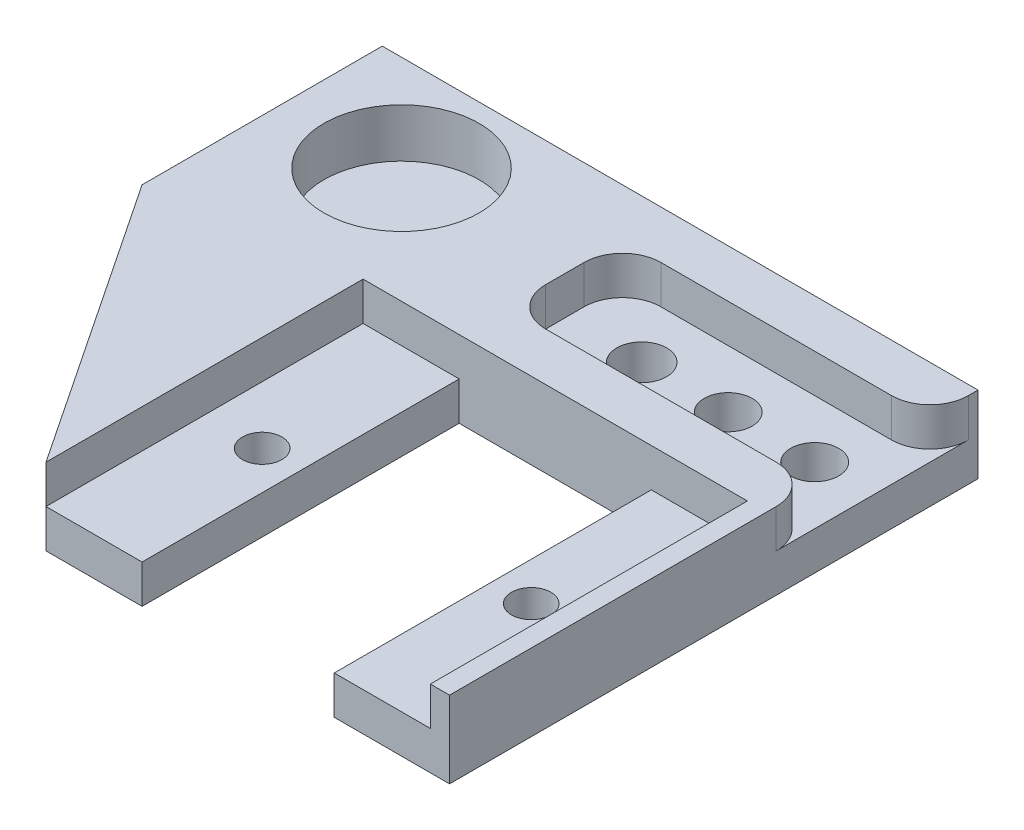
ISO-10303-21;
HEADER;
FILE_DESCRIPTION(('STEP AP214'),'2;1');
FILE_NAME('part.step','',(''),(''),'','','');
FILE_SCHEMA(('AUTOMOTIVE_DESIGN { 1 0 10303 214 1 1 1 1 }'));
ENDSEC;
DATA;
#1=APPLICATION_CONTEXT('core data for automotive mechanical design processes');
#2=APPLICATION_PROTOCOL_DEFINITION('international standard','automotive_design',2000,#1);
#3=PRODUCT_CONTEXT('',#1,'mechanical');
#4=PRODUCT('Part','Part','',(#3));
#5=PRODUCT_RELATED_PRODUCT_CATEGORY('part','',(#4));
#6=PRODUCT_DEFINITION_FORMATION('','',#4);
#7=PRODUCT_DEFINITION_CONTEXT('part definition',#1,'design');
#8=PRODUCT_DEFINITION('design','',#6,#7);
#9=PRODUCT_DEFINITION_SHAPE('','',#8);
#10=(LENGTH_UNIT() NAMED_UNIT(*) SI_UNIT(.MILLI.,.METRE.));
#11=(NAMED_UNIT(*) PLANE_ANGLE_UNIT() SI_UNIT($,.RADIAN.));
#12=(NAMED_UNIT(*) SI_UNIT($,.STERADIAN.) SOLID_ANGLE_UNIT());
#13=UNCERTAINTY_MEASURE_WITH_UNIT(LENGTH_MEASURE(1.E-05),#10,'distance_accuracy_value','');
#14=(GEOMETRIC_REPRESENTATION_CONTEXT(3) GLOBAL_UNCERTAINTY_ASSIGNED_CONTEXT((#13)) GLOBAL_UNIT_ASSIGNED_CONTEXT((#10,
#11,#12)) REPRESENTATION_CONTEXT('',''));
#15=CARTESIAN_POINT('',(0.,0.,0.));
#16=DIRECTION('',(0.,0.,1.));
#17=DIRECTION('',(1.,0.,0.));
#18=AXIS2_PLACEMENT_3D('',#15,#16,#17);
#19=CARTESIAN_POINT('',(10.,2.,30.));
#20=DIRECTION('',(0.,0.,-1.));
#21=DIRECTION('',(-1.,0.,0.));
#22=AXIS2_PLACEMENT_3D('',#19,#20,#21);
#23=PLANE('',#22);
#24=DIRECTION('',(1.,0.,0.));
#25=VECTOR('',#24,1.);
#26=CARTESIAN_POINT('',(10.,2.,30.));
#27=LINE('',#26,#25);
#28=CARTESIAN_POINT('',(30.,2.,30.));
#29=VERTEX_POINT('',#28);
#30=CARTESIAN_POINT('',(31.,2.,30.));
#31=VERTEX_POINT('',#30);
#32=EDGE_CURVE('E225',#29,#31,#27,.T.);
#33=ORIENTED_EDGE('',*,*,#32,.F.);
#34=DIRECTION('',(0.,1.,0.));
#35=VECTOR('',#34,1.);
#36=CARTESIAN_POINT('',(30.,0.,30.));
#37=LINE('',#36,#35);
#38=CARTESIAN_POINT('',(30.,0.,30.));
#39=VERTEX_POINT('',#38);
#40=EDGE_CURVE('E347',#39,#29,#37,.T.);
#41=ORIENTED_EDGE('',*,*,#40,.F.);
#42=DIRECTION('',(1.,0.,0.));
#43=VECTOR('',#42,1.);
#44=CARTESIAN_POINT('',(10.,0.,30.));
#45=LINE('',#44,#43);
#46=CARTESIAN_POINT('',(25.,0.,30.));
#47=VERTEX_POINT('',#46);
#48=EDGE_CURVE('E374',#47,#39,#45,.T.);
#49=ORIENTED_EDGE('',*,*,#48,.F.);
#50=DIRECTION('',(0.,1.,0.));
#51=VECTOR('',#50,1.);
#52=CARTESIAN_POINT('',(25.,-2.,30.));
#53=LINE('',#52,#51);
#54=CARTESIAN_POINT('',(25.,-2.,30.));
#55=VERTEX_POINT('',#54);
#56=EDGE_CURVE('E404',#55,#47,#53,.T.);
#57=ORIENTED_EDGE('',*,*,#56,.F.);
#58=DIRECTION('',(-1.,0.,0.));
#59=VECTOR('',#58,1.);
#60=CARTESIAN_POINT('',(31.,-2.,30.));
#61=LINE('',#60,#59);
#62=CARTESIAN_POINT('',(31.,-2.,30.));
#63=VERTEX_POINT('',#62);
#64=EDGE_CURVE('E423',#63,#55,#61,.T.);
#65=ORIENTED_EDGE('',*,*,#64,.F.);
#66=DIRECTION('',(0.,-1.,0.));
#67=VECTOR('',#66,1.);
#68=CARTESIAN_POINT('',(31.,2.,30.));
#69=LINE('',#68,#67);
#70=EDGE_CURVE('E234',#31,#63,#69,.T.);
#71=ORIENTED_EDGE('',*,*,#70,.F.);
#72=EDGE_LOOP('',(#33,#41,#49,#57,#65,#71));
#73=FACE_BOUND('',#72,.T.);
#74=ADVANCED_FACE('F53',(#73),#23,.F.);
#75=CARTESIAN_POINT('',(0.,2.,-15.));
#76=DIRECTION('',(1.,0.,0.));
#77=DIRECTION('',(0.,0.,-1.));
#78=AXIS2_PLACEMENT_3D('',#75,#76,#77);
#79=PLANE('',#78);
#80=DIRECTION('',(0.,0.,1.));
#81=VECTOR('',#80,1.);
#82=CARTESIAN_POINT('',(0.,2.,-15.));
#83=LINE('',#82,#81);
#84=CARTESIAN_POINT('',(0.,2.,2.5));
#85=VERTEX_POINT('',#84);
#86=CARTESIAN_POINT('',(0.,2.,15.));
#87=VERTEX_POINT('',#86);
#88=EDGE_CURVE('E207',#85,#87,#83,.T.);
#89=ORIENTED_EDGE('',*,*,#88,.F.);
#90=DIRECTION('',(0.,1.,0.));
#91=VECTOR('',#90,1.);
#92=CARTESIAN_POINT('',(0.,-8.,2.5));
#93=LINE('',#92,#91);
#94=CARTESIAN_POINT('',(0.,-2.,2.5));
#95=VERTEX_POINT('',#94);
#96=EDGE_CURVE('E193',#95,#85,#93,.T.);
#97=ORIENTED_EDGE('',*,*,#96,.F.);
#98=DIRECTION('',(0.,0.,-1.));
#99=VECTOR('',#98,1.);
#100=CARTESIAN_POINT('',(0.,-2.,15.));
#101=LINE('',#100,#99);
#102=CARTESIAN_POINT('',(0.,-2.,15.));
#103=VERTEX_POINT('',#102);
#104=EDGE_CURVE('E219',#103,#95,#101,.T.);
#105=ORIENTED_EDGE('',*,*,#104,.F.);
#106=DIRECTION('',(0.,-1.,0.));
#107=VECTOR('',#106,1.);
#108=CARTESIAN_POINT('',(0.,2.,15.));
#109=LINE('',#108,#107);
#110=EDGE_CURVE('E215',#87,#103,#109,.T.);
#111=ORIENTED_EDGE('',*,*,#110,.F.);
#112=EDGE_LOOP('',(#89,#97,#105,#111));
#113=FACE_BOUND('',#112,.T.);
#114=ADVANCED_FACE('F213',(#113),#79,.F.);
#115=CARTESIAN_POINT('',(0.,2.,15.));
#116=DIRECTION('',(0.832050294337844,0.,-0.554700196225229));
#117=DIRECTION('',(-0.554700196225229,0.,-0.832050294337844));
#118=AXIS2_PLACEMENT_3D('',#115,#116,#117);
#119=PLANE('',#118);
#120=ORIENTED_EDGE('',*,*,#110,.T.);
#121=DIRECTION('',(-0.554700196225229,0.,-0.832050294337844));
#122=VECTOR('',#121,1.);
#123=CARTESIAN_POINT('',(10.,-2.,30.));
#124=LINE('',#123,#122);
#125=CARTESIAN_POINT('',(10.,-2.,30.));
#126=VERTEX_POINT('',#125);
#127=EDGE_CURVE('E227',#126,#103,#124,.T.);
#128=ORIENTED_EDGE('',*,*,#127,.F.);
#129=DIRECTION('',(0.,-1.,0.));
#130=VECTOR('',#129,1.);
#131=CARTESIAN_POINT('',(10.,2.,30.));
#132=LINE('',#131,#130);
#133=CARTESIAN_POINT('',(10.,0.,30.));
#134=VERTEX_POINT('',#133);
#135=EDGE_CURVE('E238',#134,#126,#132,.T.);
#136=ORIENTED_EDGE('',*,*,#135,.F.);
#137=CARTESIAN_POINT('',(10.,2.,30.));
#138=VERTEX_POINT('',#137);
#139=EDGE_CURVE('E239',#138,#134,#132,.T.);
#140=ORIENTED_EDGE('',*,*,#139,.F.);
#141=DIRECTION('',(0.554700196225229,0.,0.832050294337844));
#142=VECTOR('',#141,1.);
#143=CARTESIAN_POINT('',(0.,2.,15.));
#144=LINE('',#143,#142);
#145=EDGE_CURVE('E218',#87,#138,#144,.T.);
#146=ORIENTED_EDGE('',*,*,#145,.F.);
#147=EDGE_LOOP('',(#120,#128,#136,#140,#146));
#148=FACE_BOUND('',#147,.T.);
#149=ADVANCED_FACE('F436',(#148),#119,.F.);
#150=DIRECTION('',(0.,1.,0.));
#151=VECTOR('',#150,1.);
#152=CARTESIAN_POINT('',(15.,2.,30.));
#153=LINE('',#152,#151);
#154=CARTESIAN_POINT('',(15.,-2.,30.));
#155=VERTEX_POINT('',#154);
#156=CARTESIAN_POINT('',(15.,0.,30.));
#157=VERTEX_POINT('',#156);
#158=EDGE_CURVE('E408',#155,#157,#153,.T.);
#159=ORIENTED_EDGE('',*,*,#158,.T.);
#160=EDGE_CURVE('E375',#134,#157,#45,.T.);
#161=ORIENTED_EDGE('',*,*,#160,.F.);
#162=ORIENTED_EDGE('',*,*,#135,.T.);
#163=EDGE_CURVE('E422',#155,#126,#61,.T.);
#164=ORIENTED_EDGE('',*,*,#163,.F.);
#165=EDGE_LOOP('',(#159,#161,#162,#164));
#166=FACE_BOUND('',#165,.T.);
#167=ADVANCED_FACE('F552',(#166),#23,.F.);
#168=CARTESIAN_POINT('',(58.,2.,7.00498882584149));
#169=DIRECTION('',(0.,-1.,0.));
#170=DIRECTION('',(0.,0.,-1.));
#171=AXIS2_PLACEMENT_3D('',#168,#169,#170);
#172=PLANE('',#171);
#173=CARTESIAN_POINT('',(6.,2.,7.5));
#174=DIRECTION('',(0.,1.,0.));
#175=DIRECTION('',(0.,0.,1.));
#176=AXIS2_PLACEMENT_3D('',#173,#174,#175);
#177=CIRCLE('',#176,4.04);
#178=CARTESIAN_POINT('',(6.,2.,11.54));
#179=VERTEX_POINT('',#178);
#180=EDGE_CURVE('E508',#179,#179,#177,.T.);
#181=ORIENTED_EDGE('',*,*,#180,.F.);
#182=EDGE_LOOP('',(#181));
#183=FACE_BOUND('',#182,.T.);
#184=DIRECTION('',(0.,0.,-1.));
#185=VECTOR('',#184,1.);
#186=CARTESIAN_POINT('',(31.,2.,2.));
#187=LINE('',#186,#185);
#188=CARTESIAN_POINT('',(31.,2.,3.));
#189=VERTEX_POINT('',#188);
#190=CARTESIAN_POINT('',(31.,2.,2.5));
#191=VERTEX_POINT('',#190);
#192=EDGE_CURVE('E210',#189,#191,#187,.T.);
#193=ORIENTED_EDGE('',*,*,#192,.T.);
#194=DIRECTION('',(1.,0.,0.));
#195=VECTOR('',#194,1.);
#196=CARTESIAN_POINT('',(0.,2.,2.5));
#197=LINE('',#196,#195);
#198=EDGE_CURVE('E196',#85,#191,#197,.T.);
#199=ORIENTED_EDGE('',*,*,#198,.F.);
#200=ORIENTED_EDGE('',*,*,#88,.T.);
#201=ORIENTED_EDGE('',*,*,#145,.T.);
#202=DIRECTION('',(0.,0.,1.));
#203=VECTOR('',#202,1.);
#204=CARTESIAN_POINT('',(10.,2.,30.));
#205=LINE('',#204,#203);
#206=CARTESIAN_POINT('',(10.,2.,13.5));
#207=VERTEX_POINT('',#206);
#208=EDGE_CURVE('E362',#207,#138,#205,.T.);
#209=ORIENTED_EDGE('',*,*,#208,.F.);
#210=DIRECTION('',(-1.,0.,0.));
#211=VECTOR('',#210,1.);
#212=CARTESIAN_POINT('',(25.,2.,13.5));
#213=LINE('',#212,#211);
#214=CARTESIAN_POINT('',(30.,2.,13.5));
#215=VERTEX_POINT('',#214);
#216=EDGE_CURVE('E388',#215,#207,#213,.T.);
#217=ORIENTED_EDGE('',*,*,#216,.F.);
#218=DIRECTION('',(0.,0.,-1.));
#219=VECTOR('',#218,1.);
#220=CARTESIAN_POINT('',(30.,2.,30.));
#221=LINE('',#220,#219);
#222=EDGE_CURVE('E358',#29,#215,#221,.T.);
#223=ORIENTED_EDGE('',*,*,#222,.F.);
#224=ORIENTED_EDGE('',*,*,#32,.T.);
#225=CARTESIAN_POINT('',(31.,2.,13.));
#226=VERTEX_POINT('',#225);
#227=EDGE_CURVE('E317',#31,#226,#187,.T.);
#228=ORIENTED_EDGE('',*,*,#227,.T.);
#229=CARTESIAN_POINT('',(29.,2.,13.));
#230=DIRECTION('',(0.,-1.,0.));
#231=DIRECTION('',(0.,0.,-1.));
#232=AXIS2_PLACEMENT_3D('',#229,#230,#231);
#233=CIRCLE('',#232,2.);
#234=CARTESIAN_POINT('',(29.,2.,11.));
#235=VERTEX_POINT('',#234);
#236=EDGE_CURVE('E280',#226,#235,#233,.F.);
#237=ORIENTED_EDGE('',*,*,#236,.T.);
#238=DIRECTION('',(1.,0.,0.));
#239=VECTOR('',#238,1.);
#240=CARTESIAN_POINT('',(31.,2.,11.));
#241=LINE('',#240,#239);
#242=CARTESIAN_POINT('',(17.,2.,11.));
#243=VERTEX_POINT('',#242);
#244=EDGE_CURVE('E329',#243,#235,#241,.T.);
#245=ORIENTED_EDGE('',*,*,#244,.F.);
#246=CARTESIAN_POINT('',(17.,2.,9.));
#247=DIRECTION('',(0.,-1.,0.));
#248=DIRECTION('',(0.,0.,-1.));
#249=AXIS2_PLACEMENT_3D('',#246,#247,#248);
#250=CIRCLE('',#249,2.);
#251=CARTESIAN_POINT('',(15.,2.,9.));
#252=VERTEX_POINT('',#251);
#253=EDGE_CURVE('E283',#243,#252,#250,.T.);
#254=ORIENTED_EDGE('',*,*,#253,.T.);
#255=DIRECTION('',(0.,0.,1.));
#256=VECTOR('',#255,1.);
#257=CARTESIAN_POINT('',(15.,2.,11.));
#258=LINE('',#257,#256);
#259=CARTESIAN_POINT('',(15.,2.,7.));
#260=VERTEX_POINT('',#259);
#261=EDGE_CURVE('E469',#260,#252,#258,.T.);
#262=ORIENTED_EDGE('',*,*,#261,.F.);
#263=CARTESIAN_POINT('',(17.,2.,7.));
#264=DIRECTION('',(0.,-1.,0.));
#265=DIRECTION('',(0.,0.,-1.));
#266=AXIS2_PLACEMENT_3D('',#263,#264,#265);
#267=CIRCLE('',#266,2.);
#268=CARTESIAN_POINT('',(17.,2.,5.));
#269=VERTEX_POINT('',#268);
#270=EDGE_CURVE('E286',#260,#269,#267,.T.);
#271=ORIENTED_EDGE('',*,*,#270,.T.);
#272=DIRECTION('',(-1.,0.,0.));
#273=VECTOR('',#272,1.);
#274=CARTESIAN_POINT('',(31.,2.,5.));
#275=LINE('',#274,#273);
#276=CARTESIAN_POINT('',(29.,2.,5.));
#277=VERTEX_POINT('',#276);
#278=EDGE_CURVE('E313',#277,#269,#275,.T.);
#279=ORIENTED_EDGE('',*,*,#278,.F.);
#280=CARTESIAN_POINT('',(29.,2.,3.));
#281=DIRECTION('',(0.,-1.,0.));
#282=DIRECTION('',(0.,0.,-1.));
#283=AXIS2_PLACEMENT_3D('',#280,#281,#282);
#284=CIRCLE('',#283,2.);
#285=EDGE_CURVE('E277',#277,#189,#284,.F.);
#286=ORIENTED_EDGE('',*,*,#285,.T.);
#287=EDGE_LOOP('',(#193,#199,#200,#201,#209,#217,#223,#224,#228,#237,#245,#254,#262,#271,#279,#286));
#288=FACE_BOUND('',#287,.T.);
#289=ADVANCED_FACE('F205',(#183,#288),#172,.F.);
#290=CARTESIAN_POINT('',(31.,-3.,-30.));
#291=DIRECTION('',(-1.,0.,0.));
#292=DIRECTION('',(0.,0.,1.));
#293=AXIS2_PLACEMENT_3D('',#290,#291,#292);
#294=PLANE('',#293);
#295=DIRECTION('',(0.,0.,1.));
#296=VECTOR('',#295,1.);
#297=CARTESIAN_POINT('',(31.,-2.,-30.));
#298=LINE('',#297,#296);
#299=CARTESIAN_POINT('',(31.,-2.,2.5));
#300=VERTEX_POINT('',#299);
#301=EDGE_CURVE('E419',#300,#63,#298,.T.);
#302=ORIENTED_EDGE('',*,*,#301,.F.);
#303=DIRECTION('',(0.,1.,0.));
#304=VECTOR('',#303,1.);
#305=CARTESIAN_POINT('',(31.,-8.,2.5));
#306=LINE('',#305,#304);
#307=EDGE_CURVE('E70',#300,#191,#306,.T.);
#308=ORIENTED_EDGE('',*,*,#307,.T.);
#309=ORIENTED_EDGE('',*,*,#192,.F.);
#310=DIRECTION('',(0.,1.,0.));
#311=VECTOR('',#310,1.);
#312=CARTESIAN_POINT('',(31.,-3.,3.));
#313=LINE('',#312,#311);
#314=CARTESIAN_POINT('',(31.,0.,3.));
#315=VERTEX_POINT('',#314);
#316=EDGE_CURVE('E271',#189,#315,#313,.F.);
#317=ORIENTED_EDGE('',*,*,#316,.T.);
#318=DIRECTION('',(0.,0.,-1.));
#319=VECTOR('',#318,1.);
#320=CARTESIAN_POINT('',(31.,0.,11.));
#321=LINE('',#320,#319);
#322=CARTESIAN_POINT('',(31.,0.,13.));
#323=VERTEX_POINT('',#322);
#324=EDGE_CURVE('E77',#323,#315,#321,.T.);
#325=ORIENTED_EDGE('',*,*,#324,.F.);
#326=DIRECTION('',(0.,1.,0.));
#327=VECTOR('',#326,1.);
#328=CARTESIAN_POINT('',(31.,-3.,13.));
#329=LINE('',#328,#327);
#330=EDGE_CURVE('E274',#323,#226,#329,.T.);
#331=ORIENTED_EDGE('',*,*,#330,.T.);
#332=ORIENTED_EDGE('',*,*,#227,.F.);
#333=ORIENTED_EDGE('',*,*,#70,.T.);
#334=EDGE_LOOP('',(#302,#308,#309,#317,#325,#331,#332,#333));
#335=FACE_BOUND('',#334,.T.);
#336=ADVANCED_FACE('F315',(#335),#294,.F.);
#337=CARTESIAN_POINT('',(0.,-2.,0.));
#338=DIRECTION('',(0.,1.,0.));
#339=DIRECTION('',(0.,0.,1.));
#340=AXIS2_PLACEMENT_3D('',#337,#338,#339);
#341=PLANE('',#340);
#342=CARTESIAN_POINT('',(19.,-2.,8.));
#343=DIRECTION('',(0.,-1.,0.));
#344=DIRECTION('',(0.,0.,-1.));
#345=AXIS2_PLACEMENT_3D('',#342,#343,#344);
#346=CIRCLE('',#345,1.3);
#347=CARTESIAN_POINT('',(19.,-2.,6.7));
#348=VERTEX_POINT('',#347);
#349=EDGE_CURVE('E517',#348,#348,#346,.T.);
#350=ORIENTED_EDGE('',*,*,#349,.F.);
#351=EDGE_LOOP('',(#350));
#352=FACE_BOUND('',#351,.T.);
#353=CARTESIAN_POINT('',(23.5,-2.,8.));
#354=DIRECTION('',(0.,1.,0.));
#355=DIRECTION('',(0.,0.,1.));
#356=AXIS2_PLACEMENT_3D('',#353,#354,#355);
#357=CIRCLE('',#356,1.25);
#358=CARTESIAN_POINT('',(23.5,-2.,9.25));
#359=VERTEX_POINT('',#358);
#360=EDGE_CURVE('E501',#359,#359,#357,.T.);
#361=ORIENTED_EDGE('',*,*,#360,.T.);
#362=EDGE_LOOP('',(#361));
#363=FACE_BOUND('',#362,.T.);
#364=CARTESIAN_POINT('',(28.,-2.,8.));
#365=DIRECTION('',(0.,1.,0.));
#366=DIRECTION('',(0.,0.,1.));
#367=AXIS2_PLACEMENT_3D('',#364,#365,#366);
#368=CIRCLE('',#367,1.25);
#369=CARTESIAN_POINT('',(28.,-2.,9.25));
#370=VERTEX_POINT('',#369);
#371=EDGE_CURVE('E492',#370,#370,#368,.T.);
#372=ORIENTED_EDGE('',*,*,#371,.T.);
#373=EDGE_LOOP('',(#372));
#374=FACE_BOUND('',#373,.T.);
#375=CARTESIAN_POINT('',(27.,-2.,21.75));
#376=DIRECTION('',(0.,-1.,0.));
#377=DIRECTION('',(0.,0.,-1.));
#378=AXIS2_PLACEMENT_3D('',#375,#376,#377);
#379=CIRCLE('',#378,1.02499999999999);
#380=CARTESIAN_POINT('',(27.,-2.,20.725));
#381=VERTEX_POINT('',#380);
#382=EDGE_CURVE('E324',#381,#381,#379,.T.);
#383=ORIENTED_EDGE('',*,*,#382,.F.);
#384=EDGE_LOOP('',(#383));
#385=FACE_BOUND('',#384,.T.);
#386=CARTESIAN_POINT('',(13.,-2.,21.75));
#387=DIRECTION('',(0.,-1.,0.));
#388=DIRECTION('',(0.,0.,-1.));
#389=AXIS2_PLACEMENT_3D('',#386,#387,#388);
#390=CIRCLE('',#389,1.02499999999999);
#391=CARTESIAN_POINT('',(13.,-2.,20.725));
#392=VERTEX_POINT('',#391);
#393=EDGE_CURVE('E338',#392,#392,#390,.T.);
#394=ORIENTED_EDGE('',*,*,#393,.F.);
#395=EDGE_LOOP('',(#394));
#396=FACE_BOUND('',#395,.T.);
#397=ORIENTED_EDGE('',*,*,#104,.T.);
#398=DIRECTION('',(1.,0.,0.));
#399=VECTOR('',#398,1.);
#400=CARTESIAN_POINT('',(0.,-2.,2.5));
#401=LINE('',#400,#399);
#402=EDGE_CURVE('E12',#95,#300,#401,.T.);
#403=ORIENTED_EDGE('',*,*,#402,.T.);
#404=ORIENTED_EDGE('',*,*,#301,.T.);
#405=ORIENTED_EDGE('',*,*,#64,.T.);
#406=DIRECTION('',(0.,0.,-1.));
#407=VECTOR('',#406,1.);
#408=CARTESIAN_POINT('',(25.,-2.,30.));
#409=LINE('',#408,#407);
#410=CARTESIAN_POINT('',(25.,-2.,13.5));
#411=VERTEX_POINT('',#410);
#412=EDGE_CURVE('E389',#55,#411,#409,.T.);
#413=ORIENTED_EDGE('',*,*,#412,.T.);
#414=DIRECTION('',(-1.,0.,0.));
#415=VECTOR('',#414,1.);
#416=CARTESIAN_POINT('',(25.,-2.,13.5));
#417=LINE('',#416,#415);
#418=CARTESIAN_POINT('',(15.,-2.,13.5));
#419=VERTEX_POINT('',#418);
#420=EDGE_CURVE('E393',#411,#419,#417,.T.);
#421=ORIENTED_EDGE('',*,*,#420,.T.);
#422=DIRECTION('',(0.,0.,1.));
#423=VECTOR('',#422,1.);
#424=CARTESIAN_POINT('',(15.,-2.,13.5));
#425=LINE('',#424,#423);
#426=EDGE_CURVE('E397',#419,#155,#425,.T.);
#427=ORIENTED_EDGE('',*,*,#426,.T.);
#428=ORIENTED_EDGE('',*,*,#163,.T.);
#429=ORIENTED_EDGE('',*,*,#127,.T.);
#430=EDGE_LOOP('',(#397,#403,#404,#405,#413,#421,#427,#428,#429));
#431=FACE_BOUND('',#430,.T.);
#432=ADVANCED_FACE('F432',(#352,#363,#374,#385,#396,#431),#341,.F.);
#433=CARTESIAN_POINT('',(15.,-2.,13.5));
#434=DIRECTION('',(-1.,0.,0.));
#435=DIRECTION('',(0.,0.,1.));
#436=AXIS2_PLACEMENT_3D('',#433,#434,#435);
#437=PLANE('',#436);
#438=DIRECTION('',(0.,1.,0.));
#439=VECTOR('',#438,1.);
#440=CARTESIAN_POINT('',(15.,-2.,13.5));
#441=LINE('',#440,#439);
#442=CARTESIAN_POINT('',(15.,0.,13.5));
#443=VERTEX_POINT('',#442);
#444=EDGE_CURVE('E409',#419,#443,#441,.T.);
#445=ORIENTED_EDGE('',*,*,#444,.T.);
#446=DIRECTION('',(0.,0.,1.));
#447=VECTOR('',#446,1.);
#448=CARTESIAN_POINT('',(15.,0.,13.5));
#449=LINE('',#448,#447);
#450=EDGE_CURVE('E384',#443,#157,#449,.T.);
#451=ORIENTED_EDGE('',*,*,#450,.T.);
#452=ORIENTED_EDGE('',*,*,#158,.F.);
#453=ORIENTED_EDGE('',*,*,#426,.F.);
#454=EDGE_LOOP('',(#445,#451,#452,#453));
#455=FACE_BOUND('',#454,.T.);
#456=ADVANCED_FACE('F570',(#455),#437,.F.);
#457=CARTESIAN_POINT('',(25.,-2.,30.));
#458=DIRECTION('',(1.,0.,0.));
#459=DIRECTION('',(0.,0.,-1.));
#460=AXIS2_PLACEMENT_3D('',#457,#458,#459);
#461=PLANE('',#460);
#462=ORIENTED_EDGE('',*,*,#56,.T.);
#463=DIRECTION('',(0.,0.,-1.));
#464=VECTOR('',#463,1.);
#465=CARTESIAN_POINT('',(25.,0.,30.));
#466=LINE('',#465,#464);
#467=CARTESIAN_POINT('',(25.,0.,13.5));
#468=VERTEX_POINT('',#467);
#469=EDGE_CURVE('E366',#47,#468,#466,.T.);
#470=ORIENTED_EDGE('',*,*,#469,.T.);
#471=DIRECTION('',(0.,1.,0.));
#472=VECTOR('',#471,1.);
#473=CARTESIAN_POINT('',(25.,-2.,13.5));
#474=LINE('',#473,#472);
#475=EDGE_CURVE('E401',#411,#468,#474,.T.);
#476=ORIENTED_EDGE('',*,*,#475,.F.);
#477=ORIENTED_EDGE('',*,*,#412,.F.);
#478=EDGE_LOOP('',(#462,#470,#476,#477));
#479=FACE_BOUND('',#478,.T.);
#480=ADVANCED_FACE('F573',(#479),#461,.F.);
#481=CARTESIAN_POINT('',(25.,-2.,13.5));
#482=DIRECTION('',(0.,0.,-1.));
#483=DIRECTION('',(-1.,0.,0.));
#484=AXIS2_PLACEMENT_3D('',#481,#482,#483);
#485=PLANE('',#484);
#486=ORIENTED_EDGE('',*,*,#475,.T.);
#487=DIRECTION('',(-1.,0.,0.));
#488=VECTOR('',#487,1.);
#489=CARTESIAN_POINT('',(10.,0.,13.5));
#490=LINE('',#489,#488);
#491=CARTESIAN_POINT('',(30.,0.,13.5));
#492=VERTEX_POINT('',#491);
#493=EDGE_CURVE('E367',#492,#468,#490,.T.);
#494=ORIENTED_EDGE('',*,*,#493,.F.);
#495=DIRECTION('',(0.,1.,0.));
#496=VECTOR('',#495,1.);
#497=CARTESIAN_POINT('',(30.,0.,13.5));
#498=LINE('',#497,#496);
#499=EDGE_CURVE('E351',#492,#215,#498,.T.);
#500=ORIENTED_EDGE('',*,*,#499,.T.);
#501=ORIENTED_EDGE('',*,*,#216,.T.);
#502=DIRECTION('',(0.,1.,0.));
#503=VECTOR('',#502,1.);
#504=CARTESIAN_POINT('',(10.,0.,13.5));
#505=LINE('',#504,#503);
#506=CARTESIAN_POINT('',(10.,0.,13.5));
#507=VERTEX_POINT('',#506);
#508=EDGE_CURVE('E346',#507,#207,#505,.T.);
#509=ORIENTED_EDGE('',*,*,#508,.F.);
#510=EDGE_CURVE('E350',#443,#507,#490,.T.);
#511=ORIENTED_EDGE('',*,*,#510,.F.);
#512=ORIENTED_EDGE('',*,*,#444,.F.);
#513=ORIENTED_EDGE('',*,*,#420,.F.);
#514=EDGE_LOOP('',(#486,#494,#500,#501,#509,#511,#512,#513));
#515=FACE_BOUND('',#514,.T.);
#516=ADVANCED_FACE('F446',(#515),#485,.F.);
#517=CARTESIAN_POINT('',(0.,0.,0.));
#518=DIRECTION('',(0.,-1.,0.));
#519=DIRECTION('',(0.,0.,-1.));
#520=AXIS2_PLACEMENT_3D('',#517,#518,#519);
#521=PLANE('',#520);
#522=CARTESIAN_POINT('',(27.,0.,21.75));
#523=DIRECTION('',(0.,-1.,0.));
#524=DIRECTION('',(0.,0.,-1.));
#525=AXIS2_PLACEMENT_3D('',#522,#523,#524);
#526=CIRCLE('',#525,1.02499999999999);
#527=CARTESIAN_POINT('',(27.,0.,20.725));
#528=VERTEX_POINT('',#527);
#529=EDGE_CURVE('E334',#528,#528,#526,.T.);
#530=ORIENTED_EDGE('',*,*,#529,.T.);
#531=EDGE_LOOP('',(#530));
#532=FACE_BOUND('',#531,.T.);
#533=ORIENTED_EDGE('',*,*,#48,.T.);
#534=DIRECTION('',(0.,0.,-1.));
#535=VECTOR('',#534,1.);
#536=CARTESIAN_POINT('',(30.,0.,30.));
#537=LINE('',#536,#535);
#538=EDGE_CURVE('E370',#39,#492,#537,.T.);
#539=ORIENTED_EDGE('',*,*,#538,.T.);
#540=ORIENTED_EDGE('',*,*,#493,.T.);
#541=ORIENTED_EDGE('',*,*,#469,.F.);
#542=EDGE_LOOP('',(#533,#539,#540,#541));
#543=FACE_BOUND('',#542,.T.);
#544=ADVANCED_FACE('F575',(#532,#543),#521,.F.);
#545=CARTESIAN_POINT('',(30.,0.,30.));
#546=DIRECTION('',(1.,0.,0.));
#547=DIRECTION('',(0.,0.,-1.));
#548=AXIS2_PLACEMENT_3D('',#545,#546,#547);
#549=PLANE('',#548);
#550=ORIENTED_EDGE('',*,*,#222,.T.);
#551=ORIENTED_EDGE('',*,*,#499,.F.);
#552=ORIENTED_EDGE('',*,*,#538,.F.);
#553=ORIENTED_EDGE('',*,*,#40,.T.);
#554=EDGE_LOOP('',(#550,#551,#552,#553));
#555=FACE_BOUND('',#554,.T.);
#556=ADVANCED_FACE('F451',(#555),#549,.F.);
#557=CARTESIAN_POINT('',(13.,0.,21.75));
#558=DIRECTION('',(0.,-1.,0.));
#559=DIRECTION('',(0.,0.,-1.));
#560=AXIS2_PLACEMENT_3D('',#557,#558,#559);
#561=CIRCLE('',#560,1.02499999999999);
#562=CARTESIAN_POINT('',(13.,0.,20.725));
#563=VERTEX_POINT('',#562);
#564=EDGE_CURVE('E342',#563,#563,#561,.T.);
#565=ORIENTED_EDGE('',*,*,#564,.T.);
#566=EDGE_LOOP('',(#565));
#567=FACE_BOUND('',#566,.T.);
#568=ORIENTED_EDGE('',*,*,#510,.T.);
#569=DIRECTION('',(0.,0.,1.));
#570=VECTOR('',#569,1.);
#571=CARTESIAN_POINT('',(10.,0.,30.));
#572=LINE('',#571,#570);
#573=EDGE_CURVE('E363',#507,#134,#572,.T.);
#574=ORIENTED_EDGE('',*,*,#573,.T.);
#575=ORIENTED_EDGE('',*,*,#160,.T.);
#576=ORIENTED_EDGE('',*,*,#450,.F.);
#577=EDGE_LOOP('',(#568,#574,#575,#576));
#578=FACE_BOUND('',#577,.T.);
#579=ADVANCED_FACE('F667',(#567,#578),#521,.F.);
#580=CARTESIAN_POINT('',(10.,0.,30.));
#581=DIRECTION('',(-1.,0.,0.));
#582=DIRECTION('',(0.,0.,1.));
#583=AXIS2_PLACEMENT_3D('',#580,#581,#582);
#584=PLANE('',#583);
#585=ORIENTED_EDGE('',*,*,#208,.T.);
#586=ORIENTED_EDGE('',*,*,#139,.T.);
#587=ORIENTED_EDGE('',*,*,#573,.F.);
#588=ORIENTED_EDGE('',*,*,#508,.T.);
#589=EDGE_LOOP('',(#585,#586,#587,#588));
#590=FACE_BOUND('',#589,.T.);
#591=ADVANCED_FACE('F441',(#590),#584,.F.);
#592=CARTESIAN_POINT('',(13.,-2.,21.75));
#593=DIRECTION('',(0.,-1.,0.));
#594=DIRECTION('',(0.,0.,-1.));
#595=AXIS2_PLACEMENT_3D('',#592,#593,#594);
#596=CYLINDRICAL_SURFACE('',#595,1.02499999999999);
#597=ORIENTED_EDGE('',*,*,#393,.T.);
#598=EDGE_LOOP('',(#597));
#599=FACE_BOUND('',#598,.T.);
#600=ORIENTED_EDGE('',*,*,#564,.F.);
#601=EDGE_LOOP('',(#600));
#602=FACE_BOUND('',#601,.T.);
#603=ADVANCED_FACE('F674',(#599,#602),#596,.F.);
#604=CARTESIAN_POINT('',(27.,-2.,21.75));
#605=DIRECTION('',(0.,-1.,0.));
#606=DIRECTION('',(0.,0.,-1.));
#607=AXIS2_PLACEMENT_3D('',#604,#605,#606);
#608=CYLINDRICAL_SURFACE('',#607,1.02499999999999);
#609=ORIENTED_EDGE('',*,*,#382,.T.);
#610=EDGE_LOOP('',(#609));
#611=FACE_BOUND('',#610,.T.);
#612=ORIENTED_EDGE('',*,*,#529,.F.);
#613=EDGE_LOOP('',(#612));
#614=FACE_BOUND('',#613,.T.);
#615=ADVANCED_FACE('F685',(#611,#614),#608,.F.);
#616=CARTESIAN_POINT('',(31.,0.,11.));
#617=DIRECTION('',(0.,0.,1.));
#618=DIRECTION('',(1.,0.,0.));
#619=AXIS2_PLACEMENT_3D('',#616,#617,#618);
#620=PLANE('',#619);
#621=DIRECTION('',(1.,0.,0.));
#622=VECTOR('',#621,1.);
#623=CARTESIAN_POINT('',(31.,0.,11.));
#624=LINE('',#623,#622);
#625=CARTESIAN_POINT('',(17.,0.,11.));
#626=VERTEX_POINT('',#625);
#627=CARTESIAN_POINT('',(29.,0.,11.));
#628=VERTEX_POINT('',#627);
#629=EDGE_CURVE('E318',#626,#628,#624,.T.);
#630=ORIENTED_EDGE('',*,*,#629,.F.);
#631=DIRECTION('',(0.,1.,0.));
#632=VECTOR('',#631,1.);
#633=CARTESIAN_POINT('',(17.,2.,11.));
#634=LINE('',#633,#632);
#635=EDGE_CURVE('E247',#626,#243,#634,.T.);
#636=ORIENTED_EDGE('',*,*,#635,.T.);
#637=ORIENTED_EDGE('',*,*,#244,.T.);
#638=DIRECTION('',(0.,1.,0.));
#639=VECTOR('',#638,1.);
#640=CARTESIAN_POINT('',(29.,0.,11.));
#641=LINE('',#640,#639);
#642=EDGE_CURVE('E244',#235,#628,#641,.F.);
#643=ORIENTED_EDGE('',*,*,#642,.T.);
#644=EDGE_LOOP('',(#630,#636,#637,#643));
#645=FACE_BOUND('',#644,.T.);
#646=ADVANCED_FACE('F466',(#645),#620,.F.);
#647=CARTESIAN_POINT('',(15.,0.,11.));
#648=DIRECTION('',(-1.,0.,0.));
#649=DIRECTION('',(0.,0.,1.));
#650=AXIS2_PLACEMENT_3D('',#647,#648,#649);
#651=PLANE('',#650);
#652=ORIENTED_EDGE('',*,*,#261,.T.);
#653=DIRECTION('',(0.,1.,0.));
#654=VECTOR('',#653,1.);
#655=CARTESIAN_POINT('',(15.,0.,9.));
#656=LINE('',#655,#654);
#657=CARTESIAN_POINT('',(15.,0.,9.));
#658=VERTEX_POINT('',#657);
#659=EDGE_CURVE('E255',#252,#658,#656,.F.);
#660=ORIENTED_EDGE('',*,*,#659,.T.);
#661=DIRECTION('',(0.,0.,1.));
#662=VECTOR('',#661,1.);
#663=CARTESIAN_POINT('',(15.,0.,11.));
#664=LINE('',#663,#662);
#665=CARTESIAN_POINT('',(15.,0.,7.));
#666=VERTEX_POINT('',#665);
#667=EDGE_CURVE('E311',#666,#658,#664,.T.);
#668=ORIENTED_EDGE('',*,*,#667,.F.);
#669=DIRECTION('',(0.,1.,0.));
#670=VECTOR('',#669,1.);
#671=CARTESIAN_POINT('',(15.,2.,7.));
#672=LINE('',#671,#670);
#673=EDGE_CURVE('E251',#666,#260,#672,.T.);
#674=ORIENTED_EDGE('',*,*,#673,.T.);
#675=EDGE_LOOP('',(#652,#660,#668,#674));
#676=FACE_BOUND('',#675,.T.);
#677=ADVANCED_FACE('F479',(#676),#651,.F.);
#678=CARTESIAN_POINT('',(31.,0.,5.));
#679=DIRECTION('',(0.,0.,-1.));
#680=DIRECTION('',(-1.,0.,0.));
#681=AXIS2_PLACEMENT_3D('',#678,#679,#680);
#682=PLANE('',#681);
#683=ORIENTED_EDGE('',*,*,#278,.T.);
#684=DIRECTION('',(0.,1.,0.));
#685=VECTOR('',#684,1.);
#686=CARTESIAN_POINT('',(17.,0.,5.));
#687=LINE('',#686,#685);
#688=CARTESIAN_POINT('',(17.,0.,5.));
#689=VERTEX_POINT('',#688);
#690=EDGE_CURVE('E268',#269,#689,#687,.F.);
#691=ORIENTED_EDGE('',*,*,#690,.T.);
#692=DIRECTION('',(-1.,0.,0.));
#693=VECTOR('',#692,1.);
#694=CARTESIAN_POINT('',(31.,0.,5.));
#695=LINE('',#694,#693);
#696=CARTESIAN_POINT('',(29.,0.,5.));
#697=VERTEX_POINT('',#696);
#698=EDGE_CURVE('E300',#697,#689,#695,.T.);
#699=ORIENTED_EDGE('',*,*,#698,.F.);
#700=DIRECTION('',(0.,1.,0.));
#701=VECTOR('',#700,1.);
#702=CARTESIAN_POINT('',(29.,0.,5.));
#703=LINE('',#702,#701);
#704=EDGE_CURVE('E264',#697,#277,#703,.T.);
#705=ORIENTED_EDGE('',*,*,#704,.T.);
#706=EDGE_LOOP('',(#683,#691,#699,#705));
#707=FACE_BOUND('',#706,.T.);
#708=ADVANCED_FACE('F307',(#707),#682,.F.);
#709=CARTESIAN_POINT('',(0.,0.,0.));
#710=DIRECTION('',(0.,1.,0.));
#711=DIRECTION('',(0.,0.,1.));
#712=AXIS2_PLACEMENT_3D('',#709,#710,#711);
#713=PLANE('',#712);
#714=CARTESIAN_POINT('',(19.,0.,8.));
#715=DIRECTION('',(0.,1.,0.));
#716=DIRECTION('',(0.,0.,1.));
#717=AXIS2_PLACEMENT_3D('',#714,#715,#716);
#718=CIRCLE('',#717,1.3);
#719=CARTESIAN_POINT('',(19.,0.,9.3));
#720=VERTEX_POINT('',#719);
#721=EDGE_CURVE('E57',#720,#720,#718,.T.);
#722=ORIENTED_EDGE('',*,*,#721,.F.);
#723=EDGE_LOOP('',(#722));
#724=FACE_BOUND('',#723,.T.);
#725=CARTESIAN_POINT('',(23.5,0.,8.));
#726=DIRECTION('',(0.,1.,0.));
#727=DIRECTION('',(0.,0.,1.));
#728=AXIS2_PLACEMENT_3D('',#725,#726,#727);
#729=CIRCLE('',#728,1.25);
#730=CARTESIAN_POINT('',(23.5,0.,9.25));
#731=VERTEX_POINT('',#730);
#732=EDGE_CURVE('E485',#731,#731,#729,.T.);
#733=ORIENTED_EDGE('',*,*,#732,.F.);
#734=EDGE_LOOP('',(#733));
#735=FACE_BOUND('',#734,.T.);
#736=CARTESIAN_POINT('',(28.,0.,8.));
#737=DIRECTION('',(0.,1.,0.));
#738=DIRECTION('',(0.,0.,1.));
#739=AXIS2_PLACEMENT_3D('',#736,#737,#738);
#740=CIRCLE('',#739,1.25);
#741=CARTESIAN_POINT('',(28.,0.,9.25));
#742=VERTEX_POINT('',#741);
#743=EDGE_CURVE('E496',#742,#742,#740,.T.);
#744=ORIENTED_EDGE('',*,*,#743,.F.);
#745=EDGE_LOOP('',(#744));
#746=FACE_BOUND('',#745,.T.);
#747=ORIENTED_EDGE('',*,*,#667,.T.);
#748=CARTESIAN_POINT('',(17.,0.,9.));
#749=DIRECTION('',(0.,1.,0.));
#750=DIRECTION('',(0.,0.,1.));
#751=AXIS2_PLACEMENT_3D('',#748,#749,#750);
#752=CIRCLE('',#751,2.);
#753=EDGE_CURVE('E261',#658,#626,#752,.T.);
#754=ORIENTED_EDGE('',*,*,#753,.T.);
#755=ORIENTED_EDGE('',*,*,#629,.T.);
#756=CARTESIAN_POINT('',(29.,0.,13.));
#757=DIRECTION('',(0.,1.,0.));
#758=DIRECTION('',(0.,0.,1.));
#759=AXIS2_PLACEMENT_3D('',#756,#757,#758);
#760=CIRCLE('',#759,2.);
#761=EDGE_CURVE('E289',#628,#323,#760,.F.);
#762=ORIENTED_EDGE('',*,*,#761,.T.);
#763=ORIENTED_EDGE('',*,*,#324,.T.);
#764=CARTESIAN_POINT('',(29.,0.,3.));
#765=DIRECTION('',(0.,1.,0.));
#766=DIRECTION('',(0.,0.,1.));
#767=AXIS2_PLACEMENT_3D('',#764,#765,#766);
#768=CIRCLE('',#767,2.);
#769=EDGE_CURVE('E63',#315,#697,#768,.F.);
#770=ORIENTED_EDGE('',*,*,#769,.T.);
#771=ORIENTED_EDGE('',*,*,#698,.T.);
#772=CARTESIAN_POINT('',(17.,0.,7.));
#773=DIRECTION('',(0.,1.,0.));
#774=DIRECTION('',(0.,0.,1.));
#775=AXIS2_PLACEMENT_3D('',#772,#773,#774);
#776=CIRCLE('',#775,2.);
#777=EDGE_CURVE('E258',#689,#666,#776,.T.);
#778=ORIENTED_EDGE('',*,*,#777,.T.);
#779=EDGE_LOOP('',(#747,#754,#755,#762,#763,#770,#771,#778));
#780=FACE_BOUND('',#779,.T.);
#781=ADVANCED_FACE('F299',(#724,#735,#746,#780),#713,.T.);
#782=CARTESIAN_POINT('',(17.,0.,9.));
#783=DIRECTION('',(0.,-1.,0.));
#784=DIRECTION('',(0.,0.,-1.));
#785=AXIS2_PLACEMENT_3D('',#782,#783,#784);
#786=CYLINDRICAL_SURFACE('',#785,2.);
#787=ORIENTED_EDGE('',*,*,#753,.F.);
#788=ORIENTED_EDGE('',*,*,#659,.F.);
#789=ORIENTED_EDGE('',*,*,#253,.F.);
#790=ORIENTED_EDGE('',*,*,#635,.F.);
#791=EDGE_LOOP('',(#787,#788,#789,#790));
#792=FACE_BOUND('',#791,.T.);
#793=ADVANCED_FACE('F474',(#792),#786,.F.);
#794=CARTESIAN_POINT('',(17.,0.,7.));
#795=DIRECTION('',(0.,-1.,0.));
#796=DIRECTION('',(0.,0.,-1.));
#797=AXIS2_PLACEMENT_3D('',#794,#795,#796);
#798=CYLINDRICAL_SURFACE('',#797,2.);
#799=ORIENTED_EDGE('',*,*,#777,.F.);
#800=ORIENTED_EDGE('',*,*,#690,.F.);
#801=ORIENTED_EDGE('',*,*,#270,.F.);
#802=ORIENTED_EDGE('',*,*,#673,.F.);
#803=EDGE_LOOP('',(#799,#800,#801,#802));
#804=FACE_BOUND('',#803,.T.);
#805=ADVANCED_FACE('F714',(#804),#798,.F.);
#806=CARTESIAN_POINT('',(29.,-3.,13.));
#807=DIRECTION('',(0.,1.,0.));
#808=DIRECTION('',(0.,0.,1.));
#809=AXIS2_PLACEMENT_3D('',#806,#807,#808);
#810=CYLINDRICAL_SURFACE('',#809,2.);
#811=ORIENTED_EDGE('',*,*,#761,.F.);
#812=ORIENTED_EDGE('',*,*,#642,.F.);
#813=ORIENTED_EDGE('',*,*,#236,.F.);
#814=ORIENTED_EDGE('',*,*,#330,.F.);
#815=EDGE_LOOP('',(#811,#812,#813,#814));
#816=FACE_BOUND('',#815,.T.);
#817=ADVANCED_FACE('F471',(#816),#810,.T.);
#818=CARTESIAN_POINT('',(29.,0.,3.));
#819=DIRECTION('',(0.,1.,0.));
#820=DIRECTION('',(0.,0.,1.));
#821=AXIS2_PLACEMENT_3D('',#818,#819,#820);
#822=CYLINDRICAL_SURFACE('',#821,2.);
#823=ORIENTED_EDGE('',*,*,#769,.F.);
#824=ORIENTED_EDGE('',*,*,#316,.F.);
#825=ORIENTED_EDGE('',*,*,#285,.F.);
#826=ORIENTED_EDGE('',*,*,#704,.F.);
#827=EDGE_LOOP('',(#823,#824,#825,#826));
#828=FACE_BOUND('',#827,.T.);
#829=ADVANCED_FACE('F55',(#828),#822,.T.);
#830=CARTESIAN_POINT('',(28.,-2.,8.));
#831=DIRECTION('',(0.,1.,0.));
#832=DIRECTION('',(0.,0.,1.));
#833=AXIS2_PLACEMENT_3D('',#830,#831,#832);
#834=CYLINDRICAL_SURFACE('',#833,1.25);
#835=ORIENTED_EDGE('',*,*,#371,.F.);
#836=EDGE_LOOP('',(#835));
#837=FACE_BOUND('',#836,.T.);
#838=ORIENTED_EDGE('',*,*,#743,.T.);
#839=EDGE_LOOP('',(#838));
#840=FACE_BOUND('',#839,.T.);
#841=ADVANCED_FACE('F537',(#837,#840),#834,.F.);
#842=CARTESIAN_POINT('',(23.5,-2.,8.));
#843=DIRECTION('',(0.,1.,0.));
#844=DIRECTION('',(0.,0.,1.));
#845=AXIS2_PLACEMENT_3D('',#842,#843,#844);
#846=CYLINDRICAL_SURFACE('',#845,1.25);
#847=ORIENTED_EDGE('',*,*,#360,.F.);
#848=EDGE_LOOP('',(#847));
#849=FACE_BOUND('',#848,.T.);
#850=ORIENTED_EDGE('',*,*,#732,.T.);
#851=EDGE_LOOP('',(#850));
#852=FACE_BOUND('',#851,.T.);
#853=ADVANCED_FACE('F539',(#849,#852),#846,.F.);
#854=CARTESIAN_POINT('',(6.,-0.54,7.5));
#855=DIRECTION('',(0.,1.,0.));
#856=DIRECTION('',(0.,0.,1.));
#857=AXIS2_PLACEMENT_3D('',#854,#855,#856);
#858=CYLINDRICAL_SURFACE('',#857,4.04);
#859=CARTESIAN_POINT('',(6.,-0.54,7.5));
#860=DIRECTION('',(0.,1.,0.));
#861=DIRECTION('',(0.,0.,1.));
#862=AXIS2_PLACEMENT_3D('',#859,#860,#861);
#863=CIRCLE('',#862,4.04);
#864=CARTESIAN_POINT('',(6.,-0.54,11.54));
#865=VERTEX_POINT('',#864);
#866=EDGE_CURVE('E497',#865,#865,#863,.T.);
#867=ORIENTED_EDGE('',*,*,#866,.F.);
#868=EDGE_LOOP('',(#867));
#869=FACE_BOUND('',#868,.T.);
#870=ORIENTED_EDGE('',*,*,#180,.T.);
#871=EDGE_LOOP('',(#870));
#872=FACE_BOUND('',#871,.T.);
#873=ADVANCED_FACE('F546',(#869,#872),#858,.F.);
#874=CARTESIAN_POINT('',(6.,-0.54,7.5));
#875=DIRECTION('',(0.,1.,0.));
#876=DIRECTION('',(0.,0.,1.));
#877=AXIS2_PLACEMENT_3D('',#874,#875,#876);
#878=PLANE('',#877);
#879=ORIENTED_EDGE('',*,*,#866,.T.);
#880=EDGE_LOOP('',(#879));
#881=FACE_BOUND('',#880,.T.);
#882=ADVANCED_FACE('F761',(#881),#878,.T.);
#883=CARTESIAN_POINT('',(0.,-8.,2.5));
#884=DIRECTION('',(0.,0.,1.));
#885=DIRECTION('',(1.,0.,0.));
#886=AXIS2_PLACEMENT_3D('',#883,#884,#885);
#887=PLANE('',#886);
#888=ORIENTED_EDGE('',*,*,#96,.T.);
#889=ORIENTED_EDGE('',*,*,#198,.T.);
#890=ORIENTED_EDGE('',*,*,#307,.F.);
#891=ORIENTED_EDGE('',*,*,#402,.F.);
#892=EDGE_LOOP('',(#888,#889,#890,#891));
#893=FACE_BOUND('',#892,.T.);
#894=ADVANCED_FACE('F195',(#893),#887,.F.);
#895=CARTESIAN_POINT('',(19.,2.,8.));
#896=DIRECTION('',(0.,-1.,0.));
#897=DIRECTION('',(0.,0.,-1.));
#898=AXIS2_PLACEMENT_3D('',#895,#896,#897);
#899=CYLINDRICAL_SURFACE('',#898,1.3);
#900=ORIENTED_EDGE('',*,*,#721,.T.);
#901=EDGE_LOOP('',(#900));
#902=FACE_BOUND('',#901,.T.);
#903=ORIENTED_EDGE('',*,*,#349,.T.);
#904=EDGE_LOOP('',(#903));
#905=FACE_BOUND('',#904,.T.);
#906=ADVANCED_FACE('F528',(#902,#905),#899,.F.);
#907=CLOSED_SHELL('',(#74,#114,#149,#167,#289,#336,#432,#456,#480,#516,#544,#556,#579,#591,#603,
#615,#646,#677,#708,#781,#793,#805,#817,#829,#841,#853,#873,#882,#894,#906));
#908=MANIFOLD_SOLID_BREP('B2',#907);
#909=ADVANCED_BREP_SHAPE_REPRESENTATION('',(#18,#908),#14);
#910=SHAPE_DEFINITION_REPRESENTATION(#9,#909);
ENDSEC;
END-ISO-10303-21;
